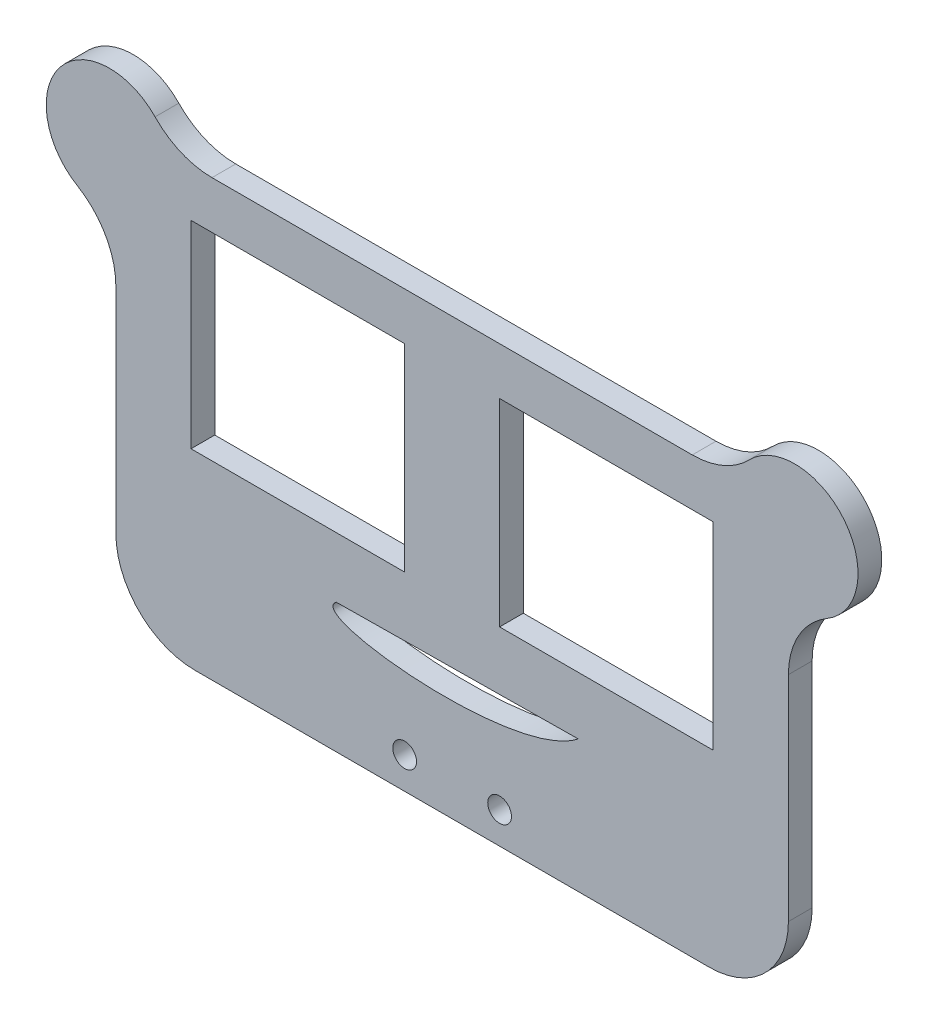
ISO-10303-21;
HEADER;
FILE_DESCRIPTION(('STEP AP214'),'2;1');
FILE_NAME('part.step','',(''),(''),'','','');
FILE_SCHEMA(('AUTOMOTIVE_DESIGN { 1 0 10303 214 1 1 1 1 }'));
ENDSEC;
DATA;
#1=APPLICATION_CONTEXT('core data for automotive mechanical design processes');
#2=APPLICATION_PROTOCOL_DEFINITION('international standard','automotive_design',2000,#1);
#3=PRODUCT_CONTEXT('',#1,'mechanical');
#4=PRODUCT('Part','Part','',(#3));
#5=PRODUCT_RELATED_PRODUCT_CATEGORY('part','',(#4));
#6=PRODUCT_DEFINITION_FORMATION('','',#4);
#7=PRODUCT_DEFINITION_CONTEXT('part definition',#1,'design');
#8=PRODUCT_DEFINITION('design','',#6,#7);
#9=PRODUCT_DEFINITION_SHAPE('','',#8);
#10=(LENGTH_UNIT() NAMED_UNIT(*) SI_UNIT(.MILLI.,.METRE.));
#11=(NAMED_UNIT(*) PLANE_ANGLE_UNIT() SI_UNIT($,.RADIAN.));
#12=(NAMED_UNIT(*) SI_UNIT($,.STERADIAN.) SOLID_ANGLE_UNIT());
#13=UNCERTAINTY_MEASURE_WITH_UNIT(LENGTH_MEASURE(1.E-05),#10,'distance_accuracy_value','');
#14=(GEOMETRIC_REPRESENTATION_CONTEXT(3) GLOBAL_UNCERTAINTY_ASSIGNED_CONTEXT((#13)) GLOBAL_UNIT_ASSIGNED_CONTEXT((#10,
#11,#12)) REPRESENTATION_CONTEXT('',''));
#15=CARTESIAN_POINT('',(0.,0.,0.));
#16=DIRECTION('',(0.,0.,1.));
#17=DIRECTION('',(1.,0.,0.));
#18=AXIS2_PLACEMENT_3D('',#15,#16,#17);
#19=CARTESIAN_POINT('',(-42.5,27.5,3.));
#20=DIRECTION('',(0.,1.,0.));
#21=DIRECTION('',(0.,0.,1.));
#22=AXIS2_PLACEMENT_3D('',#19,#20,#21);
#23=PLANE('',#22);
#24=DIRECTION('',(1.,0.,0.));
#25=VECTOR('',#24,1.);
#26=CARTESIAN_POINT('',(-42.5,27.5,3.));
#27=LINE('',#26,#25);
#28=CARTESIAN_POINT('',(-30.3494363422335,27.5,3.));
#29=VERTEX_POINT('',#28);
#30=CARTESIAN_POINT('',(30.3494363422335,27.5,3.));
#31=VERTEX_POINT('',#30);
#32=EDGE_CURVE('E398',#29,#31,#27,.T.);
#33=ORIENTED_EDGE('',*,*,#32,.T.);
#34=DIRECTION('',(0.,0.,-1.));
#35=VECTOR('',#34,1.);
#36=CARTESIAN_POINT('',(30.3494363422335,27.5,3.));
#37=LINE('',#36,#35);
#38=CARTESIAN_POINT('',(30.3494363422335,27.5,0.));
#39=VERTEX_POINT('',#38);
#40=EDGE_CURVE('E349',#31,#39,#37,.T.);
#41=ORIENTED_EDGE('',*,*,#40,.T.);
#42=DIRECTION('',(1.,0.,0.));
#43=VECTOR('',#42,1.);
#44=CARTESIAN_POINT('',(-42.5,27.5,0.));
#45=LINE('',#44,#43);
#46=CARTESIAN_POINT('',(-30.3494363422335,27.5,0.));
#47=VERTEX_POINT('',#46);
#48=EDGE_CURVE('E406',#47,#39,#45,.T.);
#49=ORIENTED_EDGE('',*,*,#48,.F.);
#50=DIRECTION('',(0.,0.,-1.));
#51=VECTOR('',#50,1.);
#52=CARTESIAN_POINT('',(-30.3494363422335,27.5,3.));
#53=LINE('',#52,#51);
#54=EDGE_CURVE('E317',#47,#29,#53,.F.);
#55=ORIENTED_EDGE('',*,*,#54,.T.);
#56=EDGE_LOOP('',(#33,#41,#49,#55));
#57=FACE_BOUND('',#56,.T.);
#58=ADVANCED_FACE('F45',(#57),#23,.T.);
#59=CARTESIAN_POINT('',(-42.5,27.5,3.));
#60=DIRECTION('',(1.,0.,0.));
#61=DIRECTION('',(0.,1.,0.));
#62=AXIS2_PLACEMENT_3D('',#59,#60,#61);
#63=PLANE('',#62);
#64=DIRECTION('',(0.,-1.,0.));
#65=VECTOR('',#64,1.);
#66=CARTESIAN_POINT('',(-42.5,27.5,3.));
#67=LINE('',#66,#65);
#68=CARTESIAN_POINT('',(-42.5,9.52798106683204,3.));
#69=VERTEX_POINT('',#68);
#70=CARTESIAN_POINT('',(-42.5,-17.5,3.));
#71=VERTEX_POINT('',#70);
#72=EDGE_CURVE('E394',#69,#71,#67,.T.);
#73=ORIENTED_EDGE('',*,*,#72,.F.);
#74=DIRECTION('',(0.,0.,1.));
#75=VECTOR('',#74,1.);
#76=CARTESIAN_POINT('',(-42.5,9.52798106683204,0.));
#77=LINE('',#76,#75);
#78=CARTESIAN_POINT('',(-42.5,9.52798106683204,0.));
#79=VERTEX_POINT('',#78);
#80=EDGE_CURVE('E340',#69,#79,#77,.F.);
#81=ORIENTED_EDGE('',*,*,#80,.T.);
#82=DIRECTION('',(0.,-1.,0.));
#83=VECTOR('',#82,1.);
#84=CARTESIAN_POINT('',(-42.5,27.5,0.));
#85=LINE('',#84,#83);
#86=CARTESIAN_POINT('',(-42.5,-17.5,0.));
#87=VERTEX_POINT('',#86);
#88=EDGE_CURVE('E395',#79,#87,#85,.T.);
#89=ORIENTED_EDGE('',*,*,#88,.T.);
#90=DIRECTION('',(0.,0.,-1.));
#91=VECTOR('',#90,1.);
#92=CARTESIAN_POINT('',(-42.5,-17.5,3.));
#93=LINE('',#92,#91);
#94=EDGE_CURVE('E376',#87,#71,#93,.F.);
#95=ORIENTED_EDGE('',*,*,#94,.T.);
#96=EDGE_LOOP('',(#73,#81,#89,#95));
#97=FACE_BOUND('',#96,.T.);
#98=ADVANCED_FACE('F278',(#97),#63,.F.);
#99=CARTESIAN_POINT('',(42.5,27.5,3.));
#100=DIRECTION('',(1.,0.,0.));
#101=DIRECTION('',(0.,1.,0.));
#102=AXIS2_PLACEMENT_3D('',#99,#100,#101);
#103=PLANE('',#102);
#104=DIRECTION('',(0.,-1.,0.));
#105=VECTOR('',#104,1.);
#106=CARTESIAN_POINT('',(42.5,27.5,0.));
#107=LINE('',#106,#105);
#108=CARTESIAN_POINT('',(42.5,9.52798106683205,0.));
#109=VERTEX_POINT('',#108);
#110=CARTESIAN_POINT('',(42.5,-17.5,0.));
#111=VERTEX_POINT('',#110);
#112=EDGE_CURVE('E403',#109,#111,#107,.T.);
#113=ORIENTED_EDGE('',*,*,#112,.F.);
#114=DIRECTION('',(0.,0.,-1.));
#115=VECTOR('',#114,1.);
#116=CARTESIAN_POINT('',(42.5,9.52798106683205,3.));
#117=LINE('',#116,#115);
#118=CARTESIAN_POINT('',(42.5,9.52798106683205,3.));
#119=VERTEX_POINT('',#118);
#120=EDGE_CURVE('E361',#109,#119,#117,.F.);
#121=ORIENTED_EDGE('',*,*,#120,.T.);
#122=DIRECTION('',(0.,-1.,0.));
#123=VECTOR('',#122,1.);
#124=CARTESIAN_POINT('',(42.5,27.5,3.));
#125=LINE('',#124,#123);
#126=CARTESIAN_POINT('',(42.5,-17.5,3.));
#127=VERTEX_POINT('',#126);
#128=EDGE_CURVE('E416',#119,#127,#125,.T.);
#129=ORIENTED_EDGE('',*,*,#128,.T.);
#130=DIRECTION('',(0.,0.,-1.));
#131=VECTOR('',#130,1.);
#132=CARTESIAN_POINT('',(42.5,-17.5,0.));
#133=LINE('',#132,#131);
#134=EDGE_CURVE('E365',#127,#111,#133,.T.);
#135=ORIENTED_EDGE('',*,*,#134,.T.);
#136=EDGE_LOOP('',(#113,#121,#129,#135));
#137=FACE_BOUND('',#136,.T.);
#138=ADVANCED_FACE('F281',(#137),#103,.T.);
#139=CARTESIAN_POINT('',(-42.5,-27.5,3.));
#140=DIRECTION('',(0.,1.,0.));
#141=DIRECTION('',(0.,0.,1.));
#142=AXIS2_PLACEMENT_3D('',#139,#140,#141);
#143=PLANE('',#142);
#144=DIRECTION('',(1.,0.,0.));
#145=VECTOR('',#144,1.);
#146=CARTESIAN_POINT('',(-42.5,-27.5,3.));
#147=LINE('',#146,#145);
#148=CARTESIAN_POINT('',(-32.5,-27.5,3.));
#149=VERTEX_POINT('',#148);
#150=CARTESIAN_POINT('',(32.5,-27.5,3.));
#151=VERTEX_POINT('',#150);
#152=EDGE_CURVE('E412',#149,#151,#147,.T.);
#153=ORIENTED_EDGE('',*,*,#152,.F.);
#154=DIRECTION('',(0.,0.,-1.));
#155=VECTOR('',#154,1.);
#156=CARTESIAN_POINT('',(-32.5,-27.5,3.));
#157=LINE('',#156,#155);
#158=CARTESIAN_POINT('',(-32.5,-27.5,0.));
#159=VERTEX_POINT('',#158);
#160=EDGE_CURVE('E387',#149,#159,#157,.T.);
#161=ORIENTED_EDGE('',*,*,#160,.T.);
#162=DIRECTION('',(1.,0.,0.));
#163=VECTOR('',#162,1.);
#164=CARTESIAN_POINT('',(-42.5,-27.5,0.));
#165=LINE('',#164,#163);
#166=CARTESIAN_POINT('',(32.5,-27.5,0.));
#167=VERTEX_POINT('',#166);
#168=EDGE_CURVE('E399',#159,#167,#165,.T.);
#169=ORIENTED_EDGE('',*,*,#168,.T.);
#170=DIRECTION('',(0.,0.,-1.));
#171=VECTOR('',#170,1.);
#172=CARTESIAN_POINT('',(32.5,-27.5,3.));
#173=LINE('',#172,#171);
#174=EDGE_CURVE('E391',#167,#151,#173,.F.);
#175=ORIENTED_EDGE('',*,*,#174,.T.);
#176=EDGE_LOOP('',(#153,#161,#169,#175));
#177=FACE_BOUND('',#176,.T.);
#178=ADVANCED_FACE('F273',(#177),#143,.F.);
#179=CARTESIAN_POINT('',(0.,0.,3.));
#180=DIRECTION('',(0.,0.,-1.));
#181=DIRECTION('',(-1.,0.,0.));
#182=AXIS2_PLACEMENT_3D('',#179,#180,#181);
#183=PLANE('',#182);
#184=CARTESIAN_POINT('',(-5.99999999999999,-23.5,3.));
#185=DIRECTION('',(0.,0.,-1.));
#186=DIRECTION('',(-1.,0.,0.));
#187=AXIS2_PLACEMENT_3D('',#184,#185,#186);
#188=CIRCLE('',#187,1.5);
#189=CARTESIAN_POINT('',(-7.49999999999999,-23.5,3.));
#190=VERTEX_POINT('',#189);
#191=EDGE_CURVE('E208',#190,#190,#188,.T.);
#192=ORIENTED_EDGE('',*,*,#191,.T.);
#193=EDGE_LOOP('',(#192));
#194=FACE_BOUND('',#193,.T.);
#195=CARTESIAN_POINT('',(6.00000000000001,-23.5,3.));
#196=DIRECTION('',(0.,0.,-1.));
#197=DIRECTION('',(-1.,0.,0.));
#198=AXIS2_PLACEMENT_3D('',#195,#196,#197);
#199=CIRCLE('',#198,1.5);
#200=CARTESIAN_POINT('',(4.50000000000001,-23.5,3.));
#201=VERTEX_POINT('',#200);
#202=EDGE_CURVE('E212',#201,#201,#199,.T.);
#203=ORIENTED_EDGE('',*,*,#202,.T.);
#204=EDGE_LOOP('',(#203));
#205=FACE_BOUND('',#204,.T.);
#206=DIRECTION('',(0.999941778285192,0.0107907386145883,0.));
#207=VECTOR('',#206,1.);
#208=CARTESIAN_POINT('',(0.118264290320377,-10.9591575696884,3.));
#209=LINE('',#208,#207);
#210=CARTESIAN_POINT('',(-14.6572237414343,-11.1186052822612,3.));
#211=VERTEX_POINT('',#210);
#212=CARTESIAN_POINT('',(15.9374972935929,-10.788446422171,3.));
#213=VERTEX_POINT('',#212);
#214=EDGE_CURVE('E535',#211,#213,#209,.T.);
#215=ORIENTED_EDGE('',*,*,#214,.T.);
#216=CARTESIAN_POINT('',(-14.6572237414343,-11.1186052822612,3.));
#217=CARTESIAN_POINT('',(-18.5338269819778,-14.1875068684662,3.));
#218=CARTESIAN_POINT('',(7.46798625050744,-17.1496640610755,3.));
#219=CARTESIAN_POINT('',(15.8016578190852,-10.8974717161916,3.));
#220=CARTESIAN_POINT('',(15.9374972935929,-10.788446422171,3.));
#221=B_SPLINE_CURVE_WITH_KNOTS('',3,(#216,#217,#218,#219,#220),.UNSPECIFIED.,.F.,.F.,(4,1,4),
(0.,0.491906710436461,0.500883110268747),.UNSPECIFIED.);
#222=EDGE_CURVE('E194',#213,#211,#221,.F.);
#223=ORIENTED_EDGE('',*,*,#222,.T.);
#224=EDGE_LOOP('',(#215,#223));
#225=FACE_BOUND('',#224,.T.);
#226=ORIENTED_EDGE('',*,*,#32,.F.);
#227=CARTESIAN_POINT('',(-30.3494363422335,37.5,3.));
#228=DIRECTION('',(0.,0.,-1.));
#229=DIRECTION('',(-1.,0.,0.));
#230=AXIS2_PLACEMENT_3D('',#227,#228,#229);
#231=CIRCLE('',#230,10.);
#232=CARTESIAN_POINT('',(-37.5448995905604,30.5555555555555,3.));
#233=VERTEX_POINT('',#232);
#234=EDGE_CURVE('E322',#29,#233,#231,.T.);
#235=ORIENTED_EDGE('',*,*,#234,.T.);
#236=CARTESIAN_POINT('',(-43.301270189222,24.9999999999999,3.));
#237=DIRECTION('',(0.,0.,1.));
#238=DIRECTION('',(1.,0.,0.));
#239=AXIS2_PLACEMENT_3D('',#236,#237,#238);
#240=CIRCLE('',#239,8.);
#241=CARTESIAN_POINT('',(-47.3895945495678,18.1235471408142,3.));
#242=VERTEX_POINT('',#241);
#243=EDGE_CURVE('E477',#233,#242,#240,.T.);
#244=ORIENTED_EDGE('',*,*,#243,.T.);
#245=CARTESIAN_POINT('',(-52.5,9.52798106683204,3.));
#246=DIRECTION('',(0.,0.,-1.));
#247=DIRECTION('',(-1.,0.,0.));
#248=AXIS2_PLACEMENT_3D('',#245,#246,#247);
#249=CIRCLE('',#248,10.);
#250=EDGE_CURVE('E54',#242,#69,#249,.T.);
#251=ORIENTED_EDGE('',*,*,#250,.T.);
#252=ORIENTED_EDGE('',*,*,#72,.T.);
#253=CARTESIAN_POINT('',(-32.5,-17.5,3.));
#254=DIRECTION('',(0.,0.,-1.));
#255=DIRECTION('',(-1.,0.,0.));
#256=AXIS2_PLACEMENT_3D('',#253,#254,#255);
#257=CIRCLE('',#256,10.);
#258=EDGE_CURVE('E369',#71,#149,#257,.F.);
#259=ORIENTED_EDGE('',*,*,#258,.T.);
#260=ORIENTED_EDGE('',*,*,#152,.T.);
#261=CARTESIAN_POINT('',(32.5,-17.5,3.));
#262=DIRECTION('',(0.,0.,-1.));
#263=DIRECTION('',(-1.,0.,0.));
#264=AXIS2_PLACEMENT_3D('',#261,#262,#263);
#265=CIRCLE('',#264,10.);
#266=EDGE_CURVE('E372',#151,#127,#265,.F.);
#267=ORIENTED_EDGE('',*,*,#266,.T.);
#268=ORIENTED_EDGE('',*,*,#128,.F.);
#269=CARTESIAN_POINT('',(52.5,9.52798106683205,3.));
#270=DIRECTION('',(0.,0.,-1.));
#271=DIRECTION('',(-1.,0.,0.));
#272=AXIS2_PLACEMENT_3D('',#269,#270,#271);
#273=CIRCLE('',#272,10.);
#274=CARTESIAN_POINT('',(47.3895945495678,18.1235471408142,3.));
#275=VERTEX_POINT('',#274);
#276=EDGE_CURVE('E337',#119,#275,#273,.T.);
#277=ORIENTED_EDGE('',*,*,#276,.T.);
#278=CARTESIAN_POINT('',(43.301270189222,24.9999999999999,3.));
#279=DIRECTION('',(0.,0.,1.));
#280=DIRECTION('',(-1.,0.,0.));
#281=AXIS2_PLACEMENT_3D('',#278,#279,#280);
#282=CIRCLE('',#281,8.);
#283=CARTESIAN_POINT('',(37.5448995905605,30.5555555555555,3.));
#284=VERTEX_POINT('',#283);
#285=EDGE_CURVE('E516',#275,#284,#282,.T.);
#286=ORIENTED_EDGE('',*,*,#285,.T.);
#287=CARTESIAN_POINT('',(30.3494363422335,37.5,3.));
#288=DIRECTION('',(0.,0.,-1.));
#289=DIRECTION('',(-1.,0.,0.));
#290=AXIS2_PLACEMENT_3D('',#287,#288,#289);
#291=CIRCLE('',#290,10.);
#292=EDGE_CURVE('E326',#284,#31,#291,.T.);
#293=ORIENTED_EDGE('',*,*,#292,.T.);
#294=EDGE_LOOP('',(#226,#235,#244,#251,#252,#259,#260,#267,#268,#277,#286,#293));
#295=FACE_BOUND('',#294,.T.);
#296=DIRECTION('',(-1.,0.,0.));
#297=VECTOR('',#296,1.);
#298=CARTESIAN_POINT('',(0.,-3.50000000000001,3.));
#299=LINE('',#298,#297);
#300=CARTESIAN_POINT('',(-6.,-3.50000000000001,3.));
#301=VERTEX_POINT('',#300);
#302=CARTESIAN_POINT('',(-33.,-3.50000000000001,3.));
#303=VERTEX_POINT('',#302);
#304=EDGE_CURVE('E433',#301,#303,#299,.T.);
#305=ORIENTED_EDGE('',*,*,#304,.T.);
#306=DIRECTION('',(0.,1.,0.));
#307=VECTOR('',#306,1.);
#308=CARTESIAN_POINT('',(-33.,0.,3.));
#309=LINE('',#308,#307);
#310=CARTESIAN_POINT('',(-33.,21.5,3.));
#311=VERTEX_POINT('',#310);
#312=EDGE_CURVE('E409',#303,#311,#309,.T.);
#313=ORIENTED_EDGE('',*,*,#312,.T.);
#314=DIRECTION('',(1.,0.,0.));
#315=VECTOR('',#314,1.);
#316=CARTESIAN_POINT('',(0.,21.5,3.));
#317=LINE('',#316,#315);
#318=CARTESIAN_POINT('',(-6.,21.5,3.));
#319=VERTEX_POINT('',#318);
#320=EDGE_CURVE('E425',#311,#319,#317,.T.);
#321=ORIENTED_EDGE('',*,*,#320,.T.);
#322=DIRECTION('',(0.,-1.,0.));
#323=VECTOR('',#322,1.);
#324=CARTESIAN_POINT('',(-6.,0.,3.));
#325=LINE('',#324,#323);
#326=EDGE_CURVE('E429',#319,#301,#325,.T.);
#327=ORIENTED_EDGE('',*,*,#326,.T.);
#328=EDGE_LOOP('',(#305,#313,#321,#327));
#329=FACE_BOUND('',#328,.T.);
#330=DIRECTION('',(1.,0.,0.));
#331=VECTOR('',#330,1.);
#332=CARTESIAN_POINT('',(0.,21.5,3.));
#333=LINE('',#332,#331);
#334=CARTESIAN_POINT('',(6.,21.5,3.));
#335=VERTEX_POINT('',#334);
#336=CARTESIAN_POINT('',(33.,21.5,3.));
#337=VERTEX_POINT('',#336);
#338=EDGE_CURVE('E449',#335,#337,#333,.T.);
#339=ORIENTED_EDGE('',*,*,#338,.T.);
#340=DIRECTION('',(0.,-1.,0.));
#341=VECTOR('',#340,1.);
#342=CARTESIAN_POINT('',(33.,0.,3.));
#343=LINE('',#342,#341);
#344=CARTESIAN_POINT('',(33.,-3.5,3.));
#345=VERTEX_POINT('',#344);
#346=EDGE_CURVE('E437',#337,#345,#343,.T.);
#347=ORIENTED_EDGE('',*,*,#346,.T.);
#348=DIRECTION('',(-1.,0.,0.));
#349=VECTOR('',#348,1.);
#350=CARTESIAN_POINT('',(0.,-3.50000000000001,3.));
#351=LINE('',#350,#349);
#352=CARTESIAN_POINT('',(6.,-3.5,3.));
#353=VERTEX_POINT('',#352);
#354=EDGE_CURVE('E441',#345,#353,#351,.T.);
#355=ORIENTED_EDGE('',*,*,#354,.T.);
#356=DIRECTION('',(0.,1.,0.));
#357=VECTOR('',#356,1.);
#358=CARTESIAN_POINT('',(6.,0.,3.));
#359=LINE('',#358,#357);
#360=EDGE_CURVE('E445',#353,#335,#359,.T.);
#361=ORIENTED_EDGE('',*,*,#360,.T.);
#362=EDGE_LOOP('',(#339,#347,#355,#361));
#363=FACE_BOUND('',#362,.T.);
#364=ADVANCED_FACE('F270',(#194,#205,#225,#295,#329,#363),#183,.F.);
#365=CARTESIAN_POINT('',(0.,0.,0.));
#366=DIRECTION('',(0.,0.,-1.));
#367=DIRECTION('',(-1.,0.,0.));
#368=AXIS2_PLACEMENT_3D('',#365,#366,#367);
#369=PLANE('',#368);
#370=CARTESIAN_POINT('',(-5.99999999999999,-23.5,0.));
#371=DIRECTION('',(0.,0.,1.));
#372=DIRECTION('',(1.,0.,0.));
#373=AXIS2_PLACEMENT_3D('',#370,#371,#372);
#374=CIRCLE('',#373,1.5);
#375=CARTESIAN_POINT('',(-4.49999999999999,-23.5,0.));
#376=VERTEX_POINT('',#375);
#377=EDGE_CURVE('E760',#376,#376,#374,.T.);
#378=ORIENTED_EDGE('',*,*,#377,.T.);
#379=EDGE_LOOP('',(#378));
#380=FACE_BOUND('',#379,.T.);
#381=CARTESIAN_POINT('',(6.00000000000001,-23.5,0.));
#382=DIRECTION('',(0.,0.,1.));
#383=DIRECTION('',(1.,0.,0.));
#384=AXIS2_PLACEMENT_3D('',#381,#382,#383);
#385=CIRCLE('',#384,1.5);
#386=CARTESIAN_POINT('',(7.50000000000001,-23.5,0.));
#387=VERTEX_POINT('',#386);
#388=EDGE_CURVE('E768',#387,#387,#385,.T.);
#389=ORIENTED_EDGE('',*,*,#388,.T.);
#390=EDGE_LOOP('',(#389));
#391=FACE_BOUND('',#390,.T.);
#392=CARTESIAN_POINT('',(-14.6572237414343,-11.1186052822612,0.));
#393=CARTESIAN_POINT('',(-18.5338269819778,-14.1875068684662,0.));
#394=CARTESIAN_POINT('',(7.46798625050744,-17.1496640610755,0.));
#395=CARTESIAN_POINT('',(15.8016578190852,-10.8974717161916,0.));
#396=CARTESIAN_POINT('',(15.9374972935929,-10.788446422171,0.));
#397=B_SPLINE_CURVE_WITH_KNOTS('',3,(#392,#393,#394,#395,#396),.UNSPECIFIED.,.F.,.F.,(4,1,4),
(0.,0.491906710436461,0.500883110268747),.UNSPECIFIED.);
#398=CARTESIAN_POINT('',(-14.6572237414343,-11.1186052822613,0.));
#399=VERTEX_POINT('',#398);
#400=CARTESIAN_POINT('',(15.9374972935929,-10.788446422171,0.));
#401=VERTEX_POINT('',#400);
#402=EDGE_CURVE('E68',#399,#401,#397,.T.);
#403=ORIENTED_EDGE('',*,*,#402,.T.);
#404=DIRECTION('',(-0.999941778285192,-0.0107907386145883,0.));
#405=VECTOR('',#404,1.);
#406=CARTESIAN_POINT('',(-14.6572237414343,-11.1186052822612,0.));
#407=LINE('',#406,#405);
#408=EDGE_CURVE('E198',#401,#399,#407,.T.);
#409=ORIENTED_EDGE('',*,*,#408,.T.);
#410=EDGE_LOOP('',(#403,#409));
#411=FACE_BOUND('',#410,.T.);
#412=CARTESIAN_POINT('',(-43.301270189222,24.9999999999999,0.));
#413=DIRECTION('',(0.,0.,1.));
#414=DIRECTION('',(1.,0.,0.));
#415=AXIS2_PLACEMENT_3D('',#412,#413,#414);
#416=CIRCLE('',#415,8.);
#417=CARTESIAN_POINT('',(-37.5448995905604,30.5555555555555,0.));
#418=VERTEX_POINT('',#417);
#419=CARTESIAN_POINT('',(-47.3895945495678,18.1235471408142,0.));
#420=VERTEX_POINT('',#419);
#421=EDGE_CURVE('E524',#418,#420,#416,.T.);
#422=ORIENTED_EDGE('',*,*,#421,.F.);
#423=CARTESIAN_POINT('',(-30.3494363422335,37.5,0.));
#424=DIRECTION('',(0.,0.,-1.));
#425=DIRECTION('',(-1.,0.,0.));
#426=AXIS2_PLACEMENT_3D('',#423,#424,#425);
#427=CIRCLE('',#426,10.);
#428=EDGE_CURVE('E314',#418,#47,#427,.F.);
#429=ORIENTED_EDGE('',*,*,#428,.T.);
#430=ORIENTED_EDGE('',*,*,#48,.T.);
#431=CARTESIAN_POINT('',(30.3494363422335,37.5,0.));
#432=DIRECTION('',(0.,0.,-1.));
#433=DIRECTION('',(-1.,0.,0.));
#434=AXIS2_PLACEMENT_3D('',#431,#432,#433);
#435=CIRCLE('',#434,10.);
#436=CARTESIAN_POINT('',(37.5448995905605,30.5555555555555,0.));
#437=VERTEX_POINT('',#436);
#438=EDGE_CURVE('E331',#39,#437,#435,.F.);
#439=ORIENTED_EDGE('',*,*,#438,.T.);
#440=CARTESIAN_POINT('',(43.301270189222,24.9999999999999,0.));
#441=DIRECTION('',(0.,0.,1.));
#442=DIRECTION('',(-1.,0.,0.));
#443=AXIS2_PLACEMENT_3D('',#440,#441,#442);
#444=CIRCLE('',#443,8.);
#445=CARTESIAN_POINT('',(47.3895945495678,18.1235471408142,0.));
#446=VERTEX_POINT('',#445);
#447=EDGE_CURVE('E520',#446,#437,#444,.T.);
#448=ORIENTED_EDGE('',*,*,#447,.F.);
#449=CARTESIAN_POINT('',(52.5,9.52798106683205,0.));
#450=DIRECTION('',(0.,0.,-1.));
#451=DIRECTION('',(-1.,0.,0.));
#452=AXIS2_PLACEMENT_3D('',#449,#450,#451);
#453=CIRCLE('',#452,10.);
#454=EDGE_CURVE('E334',#446,#109,#453,.F.);
#455=ORIENTED_EDGE('',*,*,#454,.T.);
#456=ORIENTED_EDGE('',*,*,#112,.T.);
#457=CARTESIAN_POINT('',(32.5,-17.5,0.));
#458=DIRECTION('',(0.,0.,-1.));
#459=DIRECTION('',(-1.,0.,0.));
#460=AXIS2_PLACEMENT_3D('',#457,#458,#459);
#461=CIRCLE('',#460,10.);
#462=EDGE_CURVE('E384',#111,#167,#461,.T.);
#463=ORIENTED_EDGE('',*,*,#462,.T.);
#464=ORIENTED_EDGE('',*,*,#168,.F.);
#465=CARTESIAN_POINT('',(-32.5,-17.5,0.));
#466=DIRECTION('',(0.,0.,-1.));
#467=DIRECTION('',(-1.,0.,0.));
#468=AXIS2_PLACEMENT_3D('',#465,#466,#467);
#469=CIRCLE('',#468,10.);
#470=EDGE_CURVE('E380',#159,#87,#469,.T.);
#471=ORIENTED_EDGE('',*,*,#470,.T.);
#472=ORIENTED_EDGE('',*,*,#88,.F.);
#473=CARTESIAN_POINT('',(-52.5,9.52798106683204,0.));
#474=DIRECTION('',(0.,0.,-1.));
#475=DIRECTION('',(-1.,0.,0.));
#476=AXIS2_PLACEMENT_3D('',#473,#474,#475);
#477=CIRCLE('',#476,10.);
#478=EDGE_CURVE('E11',#79,#420,#477,.F.);
#479=ORIENTED_EDGE('',*,*,#478,.T.);
#480=EDGE_LOOP('',(#422,#429,#430,#439,#448,#455,#456,#463,#464,#471,#472,#479));
#481=FACE_BOUND('',#480,.T.);
#482=DIRECTION('',(0.,-1.,0.));
#483=VECTOR('',#482,1.);
#484=CARTESIAN_POINT('',(-33.,21.5,0.));
#485=LINE('',#484,#483);
#486=CARTESIAN_POINT('',(-33.,21.5,0.));
#487=VERTEX_POINT('',#486);
#488=CARTESIAN_POINT('',(-33.,-3.50000000000001,0.));
#489=VERTEX_POINT('',#488);
#490=EDGE_CURVE('E458',#487,#489,#485,.T.);
#491=ORIENTED_EDGE('',*,*,#490,.T.);
#492=DIRECTION('',(1.,0.,0.));
#493=VECTOR('',#492,1.);
#494=CARTESIAN_POINT('',(-33.,-3.50000000000001,0.));
#495=LINE('',#494,#493);
#496=CARTESIAN_POINT('',(-6.,-3.50000000000001,0.));
#497=VERTEX_POINT('',#496);
#498=EDGE_CURVE('E509',#489,#497,#495,.T.);
#499=ORIENTED_EDGE('',*,*,#498,.T.);
#500=DIRECTION('',(0.,1.,0.));
#501=VECTOR('',#500,1.);
#502=CARTESIAN_POINT('',(-6.,21.5,0.));
#503=LINE('',#502,#501);
#504=CARTESIAN_POINT('',(-6.,21.5,0.));
#505=VERTEX_POINT('',#504);
#506=EDGE_CURVE('E505',#497,#505,#503,.T.);
#507=ORIENTED_EDGE('',*,*,#506,.T.);
#508=DIRECTION('',(-1.,0.,0.));
#509=VECTOR('',#508,1.);
#510=CARTESIAN_POINT('',(-33.,21.5,0.));
#511=LINE('',#510,#509);
#512=EDGE_CURVE('E491',#505,#487,#511,.T.);
#513=ORIENTED_EDGE('',*,*,#512,.T.);
#514=EDGE_LOOP('',(#491,#499,#507,#513));
#515=FACE_BOUND('',#514,.T.);
#516=DIRECTION('',(0.,1.,0.));
#517=VECTOR('',#516,1.);
#518=CARTESIAN_POINT('',(33.,21.5,0.));
#519=LINE('',#518,#517);
#520=CARTESIAN_POINT('',(33.,-3.5,0.));
#521=VERTEX_POINT('',#520);
#522=CARTESIAN_POINT('',(33.,21.5,0.));
#523=VERTEX_POINT('',#522);
#524=EDGE_CURVE('E454',#521,#523,#519,.T.);
#525=ORIENTED_EDGE('',*,*,#524,.T.);
#526=DIRECTION('',(-1.,0.,0.));
#527=VECTOR('',#526,1.);
#528=CARTESIAN_POINT('',(33.,21.5,0.));
#529=LINE('',#528,#527);
#530=CARTESIAN_POINT('',(6.,21.5,0.));
#531=VERTEX_POINT('',#530);
#532=EDGE_CURVE('E459',#523,#531,#529,.T.);
#533=ORIENTED_EDGE('',*,*,#532,.T.);
#534=DIRECTION('',(0.,-1.,0.));
#535=VECTOR('',#534,1.);
#536=CARTESIAN_POINT('',(6.,21.5,0.));
#537=LINE('',#536,#535);
#538=CARTESIAN_POINT('',(6.,-3.5,0.));
#539=VERTEX_POINT('',#538);
#540=EDGE_CURVE('E463',#531,#539,#537,.T.);
#541=ORIENTED_EDGE('',*,*,#540,.T.);
#542=DIRECTION('',(1.,0.,0.));
#543=VECTOR('',#542,1.);
#544=CARTESIAN_POINT('',(33.,-3.5,0.));
#545=LINE('',#544,#543);
#546=EDGE_CURVE('E467',#539,#521,#545,.T.);
#547=ORIENTED_EDGE('',*,*,#546,.T.);
#548=EDGE_LOOP('',(#525,#533,#541,#547));
#549=FACE_BOUND('',#548,.T.);
#550=ADVANCED_FACE('F205',(#380,#391,#411,#481,#515,#549),#369,.T.);
#551=CARTESIAN_POINT('',(33.,21.5,0.));
#552=DIRECTION('',(1.,0.,0.));
#553=DIRECTION('',(0.,1.,0.));
#554=AXIS2_PLACEMENT_3D('',#551,#552,#553);
#555=PLANE('',#554);
#556=DIRECTION('',(0.,0.,1.));
#557=VECTOR('',#556,1.);
#558=CARTESIAN_POINT('',(33.,21.5,0.));
#559=LINE('',#558,#557);
#560=EDGE_CURVE('E471',#523,#337,#559,.T.);
#561=ORIENTED_EDGE('',*,*,#560,.F.);
#562=ORIENTED_EDGE('',*,*,#524,.F.);
#563=DIRECTION('',(0.,0.,1.));
#564=VECTOR('',#563,1.);
#565=CARTESIAN_POINT('',(33.,-3.5,0.));
#566=LINE('',#565,#564);
#567=EDGE_CURVE('E472',#521,#345,#566,.T.);
#568=ORIENTED_EDGE('',*,*,#567,.T.);
#569=ORIENTED_EDGE('',*,*,#346,.F.);
#570=EDGE_LOOP('',(#561,#562,#568,#569));
#571=FACE_BOUND('',#570,.T.);
#572=ADVANCED_FACE('F255',(#571),#555,.F.);
#573=CARTESIAN_POINT('',(33.,-3.5,0.));
#574=DIRECTION('',(0.,-1.,0.));
#575=DIRECTION('',(1.,0.,0.));
#576=AXIS2_PLACEMENT_3D('',#573,#574,#575);
#577=PLANE('',#576);
#578=ORIENTED_EDGE('',*,*,#567,.F.);
#579=ORIENTED_EDGE('',*,*,#546,.F.);
#580=DIRECTION('',(0.,0.,1.));
#581=VECTOR('',#580,1.);
#582=CARTESIAN_POINT('',(6.,-3.5,0.));
#583=LINE('',#582,#581);
#584=EDGE_CURVE('E476',#539,#353,#583,.T.);
#585=ORIENTED_EDGE('',*,*,#584,.T.);
#586=ORIENTED_EDGE('',*,*,#354,.F.);
#587=EDGE_LOOP('',(#578,#579,#585,#586));
#588=FACE_BOUND('',#587,.T.);
#589=ADVANCED_FACE('F258',(#588),#577,.F.);
#590=CARTESIAN_POINT('',(6.,21.5,0.));
#591=DIRECTION('',(-1.,0.,0.));
#592=DIRECTION('',(0.,-1.,0.));
#593=AXIS2_PLACEMENT_3D('',#590,#591,#592);
#594=PLANE('',#593);
#595=ORIENTED_EDGE('',*,*,#584,.F.);
#596=ORIENTED_EDGE('',*,*,#540,.F.);
#597=DIRECTION('',(0.,0.,1.));
#598=VECTOR('',#597,1.);
#599=CARTESIAN_POINT('',(6.,21.5,0.));
#600=LINE('',#599,#598);
#601=EDGE_CURVE('E481',#531,#335,#600,.T.);
#602=ORIENTED_EDGE('',*,*,#601,.T.);
#603=ORIENTED_EDGE('',*,*,#360,.F.);
#604=EDGE_LOOP('',(#595,#596,#602,#603));
#605=FACE_BOUND('',#604,.T.);
#606=ADVANCED_FACE('F262',(#605),#594,.F.);
#607=CARTESIAN_POINT('',(33.,21.5,0.));
#608=DIRECTION('',(0.,1.,0.));
#609=DIRECTION('',(-1.,0.,0.));
#610=AXIS2_PLACEMENT_3D('',#607,#608,#609);
#611=PLANE('',#610);
#612=ORIENTED_EDGE('',*,*,#601,.F.);
#613=ORIENTED_EDGE('',*,*,#532,.F.);
#614=ORIENTED_EDGE('',*,*,#560,.T.);
#615=ORIENTED_EDGE('',*,*,#338,.F.);
#616=EDGE_LOOP('',(#612,#613,#614,#615));
#617=FACE_BOUND('',#616,.T.);
#618=ADVANCED_FACE('F253',(#617),#611,.F.);
#619=CARTESIAN_POINT('',(-33.,21.5,0.));
#620=DIRECTION('',(-1.,0.,0.));
#621=DIRECTION('',(0.,-1.,0.));
#622=AXIS2_PLACEMENT_3D('',#619,#620,#621);
#623=PLANE('',#622);
#624=DIRECTION('',(0.,0.,1.));
#625=VECTOR('',#624,1.);
#626=CARTESIAN_POINT('',(-33.,-3.50000000000001,0.));
#627=LINE('',#626,#625);
#628=EDGE_CURVE('E487',#489,#303,#627,.T.);
#629=ORIENTED_EDGE('',*,*,#628,.F.);
#630=ORIENTED_EDGE('',*,*,#490,.F.);
#631=DIRECTION('',(0.,0.,1.));
#632=VECTOR('',#631,1.);
#633=CARTESIAN_POINT('',(-33.,21.5,0.));
#634=LINE('',#633,#632);
#635=EDGE_CURVE('E453',#487,#311,#634,.T.);
#636=ORIENTED_EDGE('',*,*,#635,.T.);
#637=ORIENTED_EDGE('',*,*,#312,.F.);
#638=EDGE_LOOP('',(#629,#630,#636,#637));
#639=FACE_BOUND('',#638,.T.);
#640=ADVANCED_FACE('F241',(#639),#623,.F.);
#641=CARTESIAN_POINT('',(-33.,21.5,0.));
#642=DIRECTION('',(0.,1.,0.));
#643=DIRECTION('',(0.,0.,1.));
#644=AXIS2_PLACEMENT_3D('',#641,#642,#643);
#645=PLANE('',#644);
#646=ORIENTED_EDGE('',*,*,#635,.F.);
#647=ORIENTED_EDGE('',*,*,#512,.F.);
#648=DIRECTION('',(0.,0.,1.));
#649=VECTOR('',#648,1.);
#650=CARTESIAN_POINT('',(-6.,21.5,0.));
#651=LINE('',#650,#649);
#652=EDGE_CURVE('E495',#505,#319,#651,.T.);
#653=ORIENTED_EDGE('',*,*,#652,.T.);
#654=ORIENTED_EDGE('',*,*,#320,.F.);
#655=EDGE_LOOP('',(#646,#647,#653,#654));
#656=FACE_BOUND('',#655,.T.);
#657=ADVANCED_FACE('F237',(#656),#645,.F.);
#658=CARTESIAN_POINT('',(-6.,21.5,0.));
#659=DIRECTION('',(1.,0.,0.));
#660=DIRECTION('',(0.,1.,0.));
#661=AXIS2_PLACEMENT_3D('',#658,#659,#660);
#662=PLANE('',#661);
#663=ORIENTED_EDGE('',*,*,#652,.F.);
#664=ORIENTED_EDGE('',*,*,#506,.F.);
#665=DIRECTION('',(0.,0.,1.));
#666=VECTOR('',#665,1.);
#667=CARTESIAN_POINT('',(-6.,-3.50000000000001,0.));
#668=LINE('',#667,#666);
#669=EDGE_CURVE('E490',#497,#301,#668,.T.);
#670=ORIENTED_EDGE('',*,*,#669,.T.);
#671=ORIENTED_EDGE('',*,*,#326,.F.);
#672=EDGE_LOOP('',(#663,#664,#670,#671));
#673=FACE_BOUND('',#672,.T.);
#674=ADVANCED_FACE('F240',(#673),#662,.F.);
#675=CARTESIAN_POINT('',(-33.,-3.50000000000001,0.));
#676=DIRECTION('',(0.,-1.,0.));
#677=DIRECTION('',(1.,0.,0.));
#678=AXIS2_PLACEMENT_3D('',#675,#676,#677);
#679=PLANE('',#678);
#680=ORIENTED_EDGE('',*,*,#669,.F.);
#681=ORIENTED_EDGE('',*,*,#498,.F.);
#682=ORIENTED_EDGE('',*,*,#628,.T.);
#683=ORIENTED_EDGE('',*,*,#304,.F.);
#684=EDGE_LOOP('',(#680,#681,#682,#683));
#685=FACE_BOUND('',#684,.T.);
#686=ADVANCED_FACE('F245',(#685),#679,.F.);
#687=CARTESIAN_POINT('',(-32.5,-17.5,3.));
#688=DIRECTION('',(0.,0.,-1.));
#689=DIRECTION('',(-1.,0.,0.));
#690=AXIS2_PLACEMENT_3D('',#687,#688,#689);
#691=CYLINDRICAL_SURFACE('',#690,10.);
#692=ORIENTED_EDGE('',*,*,#258,.F.);
#693=ORIENTED_EDGE('',*,*,#94,.F.);
#694=ORIENTED_EDGE('',*,*,#470,.F.);
#695=ORIENTED_EDGE('',*,*,#160,.F.);
#696=EDGE_LOOP('',(#692,#693,#694,#695));
#697=FACE_BOUND('',#696,.T.);
#698=ADVANCED_FACE('F249',(#697),#691,.T.);
#699=CARTESIAN_POINT('',(32.5,-17.5,3.));
#700=DIRECTION('',(0.,0.,1.));
#701=DIRECTION('',(1.,0.,0.));
#702=AXIS2_PLACEMENT_3D('',#699,#700,#701);
#703=CYLINDRICAL_SURFACE('',#702,10.);
#704=ORIENTED_EDGE('',*,*,#266,.F.);
#705=ORIENTED_EDGE('',*,*,#174,.F.);
#706=ORIENTED_EDGE('',*,*,#462,.F.);
#707=ORIENTED_EDGE('',*,*,#134,.F.);
#708=EDGE_LOOP('',(#704,#705,#706,#707));
#709=FACE_BOUND('',#708,.T.);
#710=ADVANCED_FACE('F235',(#709),#703,.T.);
#711=CARTESIAN_POINT('',(43.301270189222,24.9999999999999,3.));
#712=DIRECTION('',(0.,0.,-1.));
#713=DIRECTION('',(-1.,0.,0.));
#714=AXIS2_PLACEMENT_3D('',#711,#712,#713);
#715=CYLINDRICAL_SURFACE('',#714,8.);
#716=ORIENTED_EDGE('',*,*,#285,.F.);
#717=DIRECTION('',(0.,0.,-1.));
#718=VECTOR('',#717,1.);
#719=CARTESIAN_POINT('',(47.3895945495678,18.1235471408142,3.));
#720=LINE('',#719,#718);
#721=EDGE_CURVE('E355',#275,#446,#720,.T.);
#722=ORIENTED_EDGE('',*,*,#721,.T.);
#723=ORIENTED_EDGE('',*,*,#447,.T.);
#724=DIRECTION('',(0.,0.,-1.));
#725=VECTOR('',#724,1.);
#726=CARTESIAN_POINT('',(37.5448995905605,30.5555555555555,3.));
#727=LINE('',#726,#725);
#728=EDGE_CURVE('E358',#437,#284,#727,.F.);
#729=ORIENTED_EDGE('',*,*,#728,.T.);
#730=EDGE_LOOP('',(#716,#722,#723,#729));
#731=FACE_BOUND('',#730,.T.);
#732=ADVANCED_FACE('F231',(#731),#715,.T.);
#733=CARTESIAN_POINT('',(-43.301270189222,24.9999999999999,3.));
#734=DIRECTION('',(0.,0.,-1.));
#735=DIRECTION('',(-1.,0.,0.));
#736=AXIS2_PLACEMENT_3D('',#733,#734,#735);
#737=CYLINDRICAL_SURFACE('',#736,8.);
#738=ORIENTED_EDGE('',*,*,#243,.F.);
#739=DIRECTION('',(0.,0.,-1.));
#740=VECTOR('',#739,1.);
#741=CARTESIAN_POINT('',(-37.5448995905604,30.5555555555555,3.));
#742=LINE('',#741,#740);
#743=EDGE_CURVE('E315',#233,#418,#742,.T.);
#744=ORIENTED_EDGE('',*,*,#743,.T.);
#745=ORIENTED_EDGE('',*,*,#421,.T.);
#746=DIRECTION('',(0.,0.,-1.));
#747=VECTOR('',#746,1.);
#748=CARTESIAN_POINT('',(-47.3895945495678,18.1235471408142,3.));
#749=LINE('',#748,#747);
#750=EDGE_CURVE('E345',#420,#242,#749,.F.);
#751=ORIENTED_EDGE('',*,*,#750,.T.);
#752=EDGE_LOOP('',(#738,#744,#745,#751));
#753=FACE_BOUND('',#752,.T.);
#754=ADVANCED_FACE('F227',(#753),#737,.T.);
#755=CARTESIAN_POINT('',(52.5,9.52798106683205,3.));
#756=DIRECTION('',(0.,0.,-1.));
#757=DIRECTION('',(-1.,0.,0.));
#758=AXIS2_PLACEMENT_3D('',#755,#756,#757);
#759=CYLINDRICAL_SURFACE('',#758,10.);
#760=ORIENTED_EDGE('',*,*,#454,.F.);
#761=ORIENTED_EDGE('',*,*,#721,.F.);
#762=ORIENTED_EDGE('',*,*,#276,.F.);
#763=ORIENTED_EDGE('',*,*,#120,.F.);
#764=EDGE_LOOP('',(#760,#761,#762,#763));
#765=FACE_BOUND('',#764,.T.);
#766=ADVANCED_FACE('F230',(#765),#759,.F.);
#767=CARTESIAN_POINT('',(30.3494363422335,37.5,3.));
#768=DIRECTION('',(0.,0.,-1.));
#769=DIRECTION('',(-1.,0.,0.));
#770=AXIS2_PLACEMENT_3D('',#767,#768,#769);
#771=CYLINDRICAL_SURFACE('',#770,10.);
#772=ORIENTED_EDGE('',*,*,#292,.F.);
#773=ORIENTED_EDGE('',*,*,#728,.F.);
#774=ORIENTED_EDGE('',*,*,#438,.F.);
#775=ORIENTED_EDGE('',*,*,#40,.F.);
#776=EDGE_LOOP('',(#772,#773,#774,#775));
#777=FACE_BOUND('',#776,.T.);
#778=ADVANCED_FACE('F300',(#777),#771,.F.);
#779=CARTESIAN_POINT('',(-30.3494363422335,37.5,3.));
#780=DIRECTION('',(0.,0.,-1.));
#781=DIRECTION('',(-1.,0.,0.));
#782=AXIS2_PLACEMENT_3D('',#779,#780,#781);
#783=CYLINDRICAL_SURFACE('',#782,10.);
#784=ORIENTED_EDGE('',*,*,#428,.F.);
#785=ORIENTED_EDGE('',*,*,#743,.F.);
#786=ORIENTED_EDGE('',*,*,#234,.F.);
#787=ORIENTED_EDGE('',*,*,#54,.F.);
#788=EDGE_LOOP('',(#784,#785,#786,#787));
#789=FACE_BOUND('',#788,.T.);
#790=ADVANCED_FACE('F303',(#789),#783,.F.);
#791=CARTESIAN_POINT('',(-52.5,9.52798106683204,3.));
#792=DIRECTION('',(0.,0.,-1.));
#793=DIRECTION('',(-1.,0.,0.));
#794=AXIS2_PLACEMENT_3D('',#791,#792,#793);
#795=CYLINDRICAL_SURFACE('',#794,10.);
#796=ORIENTED_EDGE('',*,*,#478,.F.);
#797=ORIENTED_EDGE('',*,*,#80,.F.);
#798=ORIENTED_EDGE('',*,*,#250,.F.);
#799=ORIENTED_EDGE('',*,*,#750,.F.);
#800=EDGE_LOOP('',(#796,#797,#798,#799));
#801=FACE_BOUND('',#800,.T.);
#802=ADVANCED_FACE('F47',(#801),#795,.F.);
#803=DIRECTION('',(0.,0.,1.));
#804=VECTOR('',#803,1.);
#805=SURFACE_OF_LINEAR_EXTRUSION('',#397,#804);
#806=DIRECTION('',(0.,0.,1.));
#807=VECTOR('',#806,1.);
#808=CARTESIAN_POINT('',(15.9374972935929,-10.788446422171,0.));
#809=LINE('',#808,#807);
#810=EDGE_CURVE('E61',#401,#213,#809,.T.);
#811=ORIENTED_EDGE('',*,*,#810,.F.);
#812=ORIENTED_EDGE('',*,*,#402,.F.);
#813=DIRECTION('',(0.,0.,1.));
#814=VECTOR('',#813,1.);
#815=CARTESIAN_POINT('',(-14.6572237414343,-11.1186052822612,0.));
#816=LINE('',#815,#814);
#817=EDGE_CURVE('E197',#399,#211,#816,.T.);
#818=ORIENTED_EDGE('',*,*,#817,.T.);
#819=ORIENTED_EDGE('',*,*,#222,.F.);
#820=EDGE_LOOP('',(#811,#812,#818,#819));
#821=FACE_BOUND('',#820,.T.);
#822=ADVANCED_FACE('F192',(#821),#805,.F.);
#823=CARTESIAN_POINT('',(-14.6572237414343,-11.1186052822612,0.));
#824=DIRECTION('',(-0.0107907386145883,0.999941778285192,0.));
#825=DIRECTION('',(-0.999941778285192,-0.0107907386145883,0.));
#826=AXIS2_PLACEMENT_3D('',#823,#824,#825);
#827=PLANE('',#826);
#828=ORIENTED_EDGE('',*,*,#817,.F.);
#829=ORIENTED_EDGE('',*,*,#408,.F.);
#830=ORIENTED_EDGE('',*,*,#810,.T.);
#831=ORIENTED_EDGE('',*,*,#214,.F.);
#832=EDGE_LOOP('',(#828,#829,#830,#831));
#833=FACE_BOUND('',#832,.T.);
#834=ADVANCED_FACE('F201',(#833),#827,.F.);
#835=CARTESIAN_POINT('',(6.00000000000001,-23.5,0.));
#836=DIRECTION('',(0.,0.,1.));
#837=DIRECTION('',(1.,0.,0.));
#838=AXIS2_PLACEMENT_3D('',#835,#836,#837);
#839=CYLINDRICAL_SURFACE('',#838,1.5);
#840=ORIENTED_EDGE('',*,*,#388,.F.);
#841=EDGE_LOOP('',(#840));
#842=FACE_BOUND('',#841,.T.);
#843=ORIENTED_EDGE('',*,*,#202,.F.);
#844=EDGE_LOOP('',(#843));
#845=FACE_BOUND('',#844,.T.);
#846=ADVANCED_FACE('F596',(#842,#845),#839,.F.);
#847=CARTESIAN_POINT('',(-5.99999999999999,-23.5,0.));
#848=DIRECTION('',(0.,0.,1.));
#849=DIRECTION('',(1.,0.,0.));
#850=AXIS2_PLACEMENT_3D('',#847,#848,#849);
#851=CYLINDRICAL_SURFACE('',#850,1.5);
#852=ORIENTED_EDGE('',*,*,#377,.F.);
#853=EDGE_LOOP('',(#852));
#854=FACE_BOUND('',#853,.T.);
#855=ORIENTED_EDGE('',*,*,#191,.F.);
#856=EDGE_LOOP('',(#855));
#857=FACE_BOUND('',#856,.T.);
#858=ADVANCED_FACE('F615',(#854,#857),#851,.F.);
#859=CLOSED_SHELL('',(#58,#98,#138,#178,#364,#550,#572,#589,#606,#618,#640,#657,#674,#686,#698,
#710,#732,#754,#766,#778,#790,#802,#822,#834,#846,#858));
#860=MANIFOLD_SOLID_BREP('B2',#859);
#861=ADVANCED_BREP_SHAPE_REPRESENTATION('',(#18,#860),#14);
#862=SHAPE_DEFINITION_REPRESENTATION(#9,#861);
ENDSEC;
END-ISO-10303-21;
